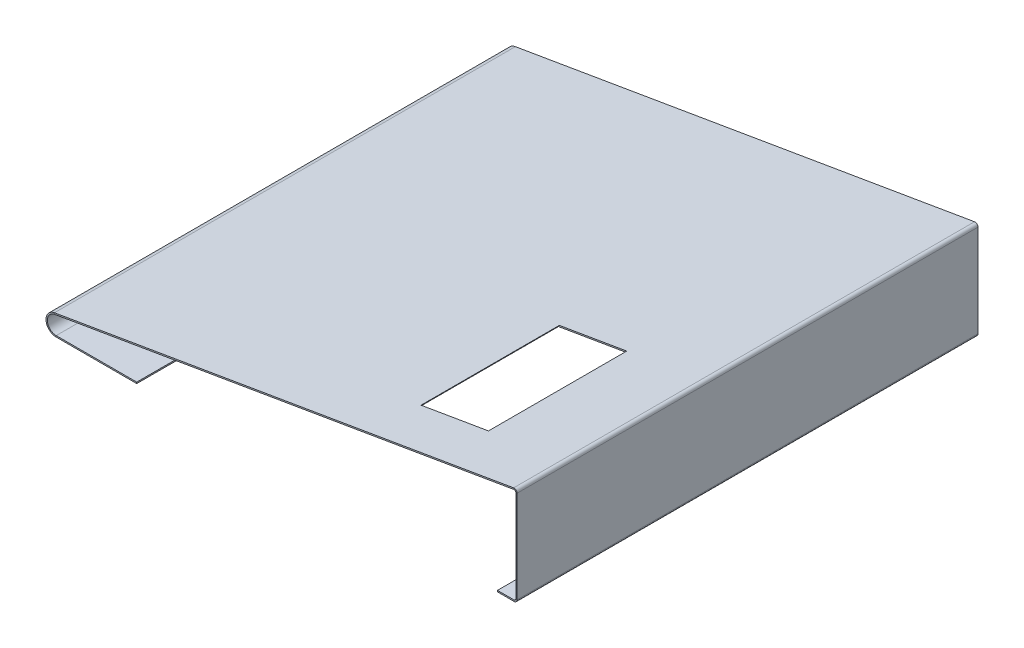
ISO-10303-21;
HEADER;
FILE_DESCRIPTION(('STEP AP214'),'2;1');
FILE_NAME('part.step','',(''),(''),'','','');
FILE_SCHEMA(('AUTOMOTIVE_DESIGN { 1 0 10303 214 1 1 1 1 }'));
ENDSEC;
DATA;
#1=APPLICATION_CONTEXT('core data for automotive mechanical design processes');
#2=APPLICATION_PROTOCOL_DEFINITION('international standard','automotive_design',2000,#1);
#3=PRODUCT_CONTEXT('',#1,'mechanical');
#4=PRODUCT('Part','Part','',(#3));
#5=PRODUCT_RELATED_PRODUCT_CATEGORY('part','',(#4));
#6=PRODUCT_DEFINITION_FORMATION('','',#4);
#7=PRODUCT_DEFINITION_CONTEXT('part definition',#1,'design');
#8=PRODUCT_DEFINITION('design','',#6,#7);
#9=PRODUCT_DEFINITION_SHAPE('','',#8);
#10=(LENGTH_UNIT() NAMED_UNIT(*) SI_UNIT(.MILLI.,.METRE.));
#11=(NAMED_UNIT(*) PLANE_ANGLE_UNIT() SI_UNIT($,.RADIAN.));
#12=(NAMED_UNIT(*) SI_UNIT($,.STERADIAN.) SOLID_ANGLE_UNIT());
#13=UNCERTAINTY_MEASURE_WITH_UNIT(LENGTH_MEASURE(1.E-05),#10,'distance_accuracy_value','');
#14=(GEOMETRIC_REPRESENTATION_CONTEXT(3) GLOBAL_UNCERTAINTY_ASSIGNED_CONTEXT((#13)) GLOBAL_UNIT_ASSIGNED_CONTEXT((#10,
#11,#12)) REPRESENTATION_CONTEXT('',''));
#15=CARTESIAN_POINT('',(0.,0.,0.));
#16=DIRECTION('',(0.,0.,1.));
#17=DIRECTION('',(1.,0.,0.));
#18=AXIS2_PLACEMENT_3D('',#15,#16,#17);
#19=CARTESIAN_POINT('',(-293.447847202276,721.981301966725,177.8));
#20=DIRECTION('',(-1.,0.,0.));
#21=DIRECTION('',(0.,-1.,0.));
#22=AXIS2_PLACEMENT_3D('',#19,#20,#21);
#23=PLANE('',#22);
#24=DIRECTION('',(0.,-1.,0.));
#25=VECTOR('',#24,1.);
#26=CARTESIAN_POINT('',(-293.447847202276,721.981301966725,177.8));
#27=LINE('',#26,#25);
#28=CARTESIAN_POINT('',(-293.447847202275,1.01599999999998,177.8));
#29=VERTEX_POINT('',#28);
#30=CARTESIAN_POINT('',(-293.447847202275,-1.11022302462516E-13,177.8));
#31=VERTEX_POINT('',#30);
#32=EDGE_CURVE('E75',#29,#31,#27,.T.);
#33=ORIENTED_EDGE('',*,*,#32,.T.);
#34=DIRECTION('',(0.,0.,-1.));
#35=VECTOR('',#34,1.);
#36=CARTESIAN_POINT('',(-293.447847202275,0.,177.8));
#37=LINE('',#36,#35);
#38=CARTESIAN_POINT('',(-293.447847202275,0.,-177.8));
#39=VERTEX_POINT('',#38);
#40=EDGE_CURVE('E68',#31,#39,#37,.T.);
#41=ORIENTED_EDGE('',*,*,#40,.T.);
#42=DIRECTION('',(0.,-1.,0.));
#43=VECTOR('',#42,1.);
#44=CARTESIAN_POINT('',(-293.447847202276,721.981301966725,-177.8));
#45=LINE('',#44,#43);
#46=CARTESIAN_POINT('',(-293.447847202276,1.01600000000009,-177.8));
#47=VERTEX_POINT('',#46);
#48=EDGE_CURVE('E325',#47,#39,#45,.T.);
#49=ORIENTED_EDGE('',*,*,#48,.F.);
#50=DIRECTION('',(0.,0.,1.));
#51=VECTOR('',#50,1.);
#52=CARTESIAN_POINT('',(-293.447847202275,1.01599999999998,177.8));
#53=LINE('',#52,#51);
#54=EDGE_CURVE('E44',#29,#47,#53,.F.);
#55=ORIENTED_EDGE('',*,*,#54,.F.);
#56=EDGE_LOOP('',(#33,#41,#49,#55));
#57=FACE_BOUND('',#56,.T.);
#58=ADVANCED_FACE('F34',(#57),#23,.F.);
#59=CARTESIAN_POINT('',(-355.6,721.981301966725,177.8));
#60=DIRECTION('',(0.,0.,-1.));
#61=DIRECTION('',(0.985896256736996,-0.167357613964763,0.));
#62=AXIS2_PLACEMENT_3D('',#59,#60,#61);
#63=PLANE('',#62);
#64=DIRECTION('',(0.,-1.,0.));
#65=VECTOR('',#64,1.);
#66=CARTESIAN_POINT('',(-355.6,721.981301966725,177.8));
#67=LINE('',#66,#65);
#68=CARTESIAN_POINT('',(-355.6,1.01599999999994,177.8));
#69=VERTEX_POINT('',#68);
#70=CARTESIAN_POINT('',(-355.6,0.,177.8));
#71=VERTEX_POINT('',#70);
#72=EDGE_CURVE('E221',#69,#71,#67,.T.);
#73=ORIENTED_EDGE('',*,*,#72,.T.);
#74=DIRECTION('',(1.,0.,0.));
#75=VECTOR('',#74,1.);
#76=CARTESIAN_POINT('',(0.,0.,177.8));
#77=LINE('',#76,#75);
#78=EDGE_CURVE('E216',#71,#31,#77,.T.);
#79=ORIENTED_EDGE('',*,*,#78,.T.);
#80=ORIENTED_EDGE('',*,*,#32,.F.);
#81=DIRECTION('',(1.,0.,0.));
#82=VECTOR('',#81,1.);
#83=CARTESIAN_POINT('',(-355.6,1.01599999999998,177.8));
#84=LINE('',#83,#82);
#85=EDGE_CURVE('E11',#69,#29,#84,.T.);
#86=ORIENTED_EDGE('',*,*,#85,.F.);
#87=EDGE_LOOP('',(#73,#79,#80,#86));
#88=FACE_BOUND('',#87,.T.);
#89=ADVANCED_FACE('F229',(#88),#63,.F.);
#90=CARTESIAN_POINT('',(0.,0.,177.8));
#91=DIRECTION('',(0.,1.,0.));
#92=DIRECTION('',(-1.,0.,0.));
#93=AXIS2_PLACEMENT_3D('',#90,#91,#92);
#94=PLANE('',#93);
#95=ORIENTED_EDGE('',*,*,#40,.F.);
#96=ORIENTED_EDGE('',*,*,#78,.F.);
#97=DIRECTION('',(0.,0.,-1.));
#98=VECTOR('',#97,1.);
#99=CARTESIAN_POINT('',(-355.6,0.,177.8));
#100=LINE('',#99,#98);
#101=CARTESIAN_POINT('',(-355.6,0.,-177.8));
#102=VERTEX_POINT('',#101);
#103=EDGE_CURVE('E207',#71,#102,#100,.T.);
#104=ORIENTED_EDGE('',*,*,#103,.T.);
#105=DIRECTION('',(1.,0.,0.));
#106=VECTOR('',#105,1.);
#107=CARTESIAN_POINT('',(0.,0.,-177.8));
#108=LINE('',#107,#106);
#109=EDGE_CURVE('E215',#102,#39,#108,.T.);
#110=ORIENTED_EDGE('',*,*,#109,.T.);
#111=EDGE_LOOP('',(#95,#96,#104,#110));
#112=FACE_BOUND('',#111,.T.);
#113=ADVANCED_FACE('F227',(#112),#94,.F.);
#114=CARTESIAN_POINT('',(-355.6,721.981301966725,-177.8));
#115=DIRECTION('',(0.,0.,-1.));
#116=DIRECTION('',(0.985896256736996,-0.167357613964763,0.));
#117=AXIS2_PLACEMENT_3D('',#114,#115,#116);
#118=PLANE('',#117);
#119=ORIENTED_EDGE('',*,*,#109,.F.);
#120=DIRECTION('',(0.,-1.,0.));
#121=VECTOR('',#120,1.);
#122=CARTESIAN_POINT('',(-355.6,721.981301966725,-177.8));
#123=LINE('',#122,#121);
#124=CARTESIAN_POINT('',(-355.6,1.01599999999994,-177.8));
#125=VERTEX_POINT('',#124);
#126=EDGE_CURVE('E235',#125,#102,#123,.T.);
#127=ORIENTED_EDGE('',*,*,#126,.F.);
#128=DIRECTION('',(1.,0.,0.));
#129=VECTOR('',#128,1.);
#130=CARTESIAN_POINT('',(-355.6,1.01599999999998,-177.8));
#131=LINE('',#130,#129);
#132=EDGE_CURVE('E53',#125,#47,#131,.T.);
#133=ORIENTED_EDGE('',*,*,#132,.T.);
#134=ORIENTED_EDGE('',*,*,#48,.T.);
#135=EDGE_LOOP('',(#119,#127,#133,#134));
#136=FACE_BOUND('',#135,.T.);
#137=ADVANCED_FACE('F329',(#136),#118,.T.);
#138=CARTESIAN_POINT('',(0.,1.01600000000002,177.8));
#139=DIRECTION('',(0.,1.,0.));
#140=DIRECTION('',(-1.,0.,0.));
#141=AXIS2_PLACEMENT_3D('',#138,#139,#140);
#142=PLANE('',#141);
#143=ORIENTED_EDGE('',*,*,#54,.T.);
#144=ORIENTED_EDGE('',*,*,#132,.F.);
#145=DIRECTION('',(0.,0.,1.));
#146=VECTOR('',#145,1.);
#147=CARTESIAN_POINT('',(-355.6,1.01599999999998,177.8));
#148=LINE('',#147,#146);
#149=EDGE_CURVE('E38',#69,#125,#148,.F.);
#150=ORIENTED_EDGE('',*,*,#149,.F.);
#151=ORIENTED_EDGE('',*,*,#85,.T.);
#152=EDGE_LOOP('',(#143,#144,#150,#151));
#153=FACE_BOUND('',#152,.T.);
#154=ADVANCED_FACE('F36',(#153),#142,.T.);
#155=CARTESIAN_POINT('',(-15.1470310183191,711.664994555315,177.8));
#156=DIRECTION('',(1.,0.,0.));
#157=DIRECTION('',(0.,1.,0.));
#158=AXIS2_PLACEMENT_3D('',#155,#156,#157);
#159=PLANE('',#158);
#160=DIRECTION('',(0.,-1.,0.));
#161=VECTOR('',#160,1.);
#162=CARTESIAN_POINT('',(-15.147031018319,711.664994555315,-177.8));
#163=LINE('',#162,#161);
#164=CARTESIAN_POINT('',(-15.1470310183189,1.01600000000009,-177.8));
#165=VERTEX_POINT('',#164);
#166=CARTESIAN_POINT('',(-15.147031018319,0.,-177.8));
#167=VERTEX_POINT('',#166);
#168=EDGE_CURVE('E316',#165,#167,#163,.T.);
#169=ORIENTED_EDGE('',*,*,#168,.T.);
#170=DIRECTION('',(0.,0.,1.));
#171=VECTOR('',#170,1.);
#172=CARTESIAN_POINT('',(-15.147031018319,0.,177.8));
#173=LINE('',#172,#171);
#174=CARTESIAN_POINT('',(-15.147031018319,0.,177.8));
#175=VERTEX_POINT('',#174);
#176=EDGE_CURVE('E312',#167,#175,#173,.T.);
#177=ORIENTED_EDGE('',*,*,#176,.T.);
#178=DIRECTION('',(0.,-1.,0.));
#179=VECTOR('',#178,1.);
#180=CARTESIAN_POINT('',(-15.1470310183191,711.664994555315,177.8));
#181=LINE('',#180,#179);
#182=CARTESIAN_POINT('',(-15.147031018319,1.01599999999999,177.8));
#183=VERTEX_POINT('',#182);
#184=EDGE_CURVE('E307',#183,#175,#181,.T.);
#185=ORIENTED_EDGE('',*,*,#184,.F.);
#186=DIRECTION('',(0.,0.,-1.));
#187=VECTOR('',#186,1.);
#188=CARTESIAN_POINT('',(-15.147031018319,1.016,177.8));
#189=LINE('',#188,#187);
#190=EDGE_CURVE('E130',#165,#183,#189,.F.);
#191=ORIENTED_EDGE('',*,*,#190,.F.);
#192=EDGE_LOOP('',(#169,#177,#185,#191));
#193=FACE_BOUND('',#192,.T.);
#194=ADVANCED_FACE('F335',(#193),#159,.F.);
#195=CARTESIAN_POINT('',(0.,1.01600000000002,177.8));
#196=DIRECTION('',(0.,1.,0.));
#197=DIRECTION('',(-1.,0.,0.));
#198=AXIS2_PLACEMENT_3D('',#195,#196,#197);
#199=PLANE('',#198);
#200=DIRECTION('',(0.,0.,1.));
#201=VECTOR('',#200,1.);
#202=CARTESIAN_POINT('',(-2.28599999999998,1.01600000000009,-177.8));
#203=LINE('',#202,#201);
#204=CARTESIAN_POINT('',(-2.28599999999995,1.01600000000002,-177.8));
#205=VERTEX_POINT('',#204);
#206=CARTESIAN_POINT('',(-2.28599999999995,1.01600000000002,177.8));
#207=VERTEX_POINT('',#206);
#208=EDGE_CURVE('E290',#205,#207,#203,.T.);
#209=ORIENTED_EDGE('',*,*,#208,.F.);
#210=DIRECTION('',(1.,0.,0.));
#211=VECTOR('',#210,1.);
#212=CARTESIAN_POINT('',(-355.6,1.01599999999996,-177.8));
#213=LINE('',#212,#211);
#214=EDGE_CURVE('E295',#165,#205,#213,.T.);
#215=ORIENTED_EDGE('',*,*,#214,.F.);
#216=ORIENTED_EDGE('',*,*,#190,.T.);
#217=DIRECTION('',(1.,0.,0.));
#218=VECTOR('',#217,1.);
#219=CARTESIAN_POINT('',(-355.6,1.01599999999996,177.8));
#220=LINE('',#219,#218);
#221=EDGE_CURVE('E124',#183,#207,#220,.T.);
#222=ORIENTED_EDGE('',*,*,#221,.T.);
#223=EDGE_LOOP('',(#209,#215,#216,#222));
#224=FACE_BOUND('',#223,.T.);
#225=ADVANCED_FACE('F388',(#224),#199,.T.);
#226=CARTESIAN_POINT('',(-355.6,711.664994555315,177.8));
#227=DIRECTION('',(0.,0.,-1.));
#228=DIRECTION('',(0.985896256736996,-0.167357613964763,0.));
#229=AXIS2_PLACEMENT_3D('',#226,#227,#228);
#230=PLANE('',#229);
#231=ORIENTED_EDGE('',*,*,#184,.T.);
#232=DIRECTION('',(1.,0.,0.));
#233=VECTOR('',#232,1.);
#234=CARTESIAN_POINT('',(0.,0.,177.8));
#235=LINE('',#234,#233);
#236=CARTESIAN_POINT('',(-2.28599999999997,0.,177.8));
#237=VERTEX_POINT('',#236);
#238=EDGE_CURVE('E304',#175,#237,#235,.T.);
#239=ORIENTED_EDGE('',*,*,#238,.T.);
#240=DIRECTION('',(0.,-1.,0.));
#241=VECTOR('',#240,1.);
#242=CARTESIAN_POINT('',(-2.28600000000004,711.664994555315,177.8));
#243=LINE('',#242,#241);
#244=EDGE_CURVE('E284',#207,#237,#243,.T.);
#245=ORIENTED_EDGE('',*,*,#244,.F.);
#246=ORIENTED_EDGE('',*,*,#221,.F.);
#247=EDGE_LOOP('',(#231,#239,#245,#246));
#248=FACE_BOUND('',#247,.T.);
#249=ADVANCED_FACE('F384',(#248),#230,.F.);
#250=CARTESIAN_POINT('',(0.,0.,177.8));
#251=DIRECTION('',(0.,1.,0.));
#252=DIRECTION('',(-1.,0.,0.));
#253=AXIS2_PLACEMENT_3D('',#250,#251,#252);
#254=PLANE('',#253);
#255=DIRECTION('',(1.,0.,0.));
#256=VECTOR('',#255,1.);
#257=CARTESIAN_POINT('',(0.,0.,-177.8));
#258=LINE('',#257,#256);
#259=CARTESIAN_POINT('',(-2.28599999999994,0.,-177.8));
#260=VERTEX_POINT('',#259);
#261=EDGE_CURVE('E301',#167,#260,#258,.T.);
#262=ORIENTED_EDGE('',*,*,#261,.T.);
#263=DIRECTION('',(0.,0.,1.));
#264=VECTOR('',#263,1.);
#265=CARTESIAN_POINT('',(-2.286,0.,-177.8));
#266=LINE('',#265,#264);
#267=EDGE_CURVE('E298',#260,#237,#266,.T.);
#268=ORIENTED_EDGE('',*,*,#267,.T.);
#269=ORIENTED_EDGE('',*,*,#238,.F.);
#270=ORIENTED_EDGE('',*,*,#176,.F.);
#271=EDGE_LOOP('',(#262,#268,#269,#270));
#272=FACE_BOUND('',#271,.T.);
#273=ADVANCED_FACE('F380',(#272),#254,.F.);
#274=CARTESIAN_POINT('',(-355.6,711.664994555315,-177.8));
#275=DIRECTION('',(0.,0.,-1.));
#276=DIRECTION('',(0.985896256736996,-0.167357613964763,0.));
#277=AXIS2_PLACEMENT_3D('',#274,#275,#276);
#278=PLANE('',#277);
#279=ORIENTED_EDGE('',*,*,#261,.F.);
#280=ORIENTED_EDGE('',*,*,#168,.F.);
#281=ORIENTED_EDGE('',*,*,#214,.T.);
#282=DIRECTION('',(0.,-1.,0.));
#283=VECTOR('',#282,1.);
#284=CARTESIAN_POINT('',(-2.28600000000004,711.664994555315,-177.8));
#285=LINE('',#284,#283);
#286=EDGE_CURVE('E292',#205,#260,#285,.T.);
#287=ORIENTED_EDGE('',*,*,#286,.T.);
#288=EDGE_LOOP('',(#279,#280,#281,#287));
#289=FACE_BOUND('',#288,.T.);
#290=ADVANCED_FACE('F376',(#289),#278,.T.);
#291=CARTESIAN_POINT('',(-2.286,2.28600000000001,-818.521085157231));
#292=DIRECTION('',(0.,0.,1.));
#293=DIRECTION('',(-0.167357613964763,-0.985896256736996,0.));
#294=AXIS2_PLACEMENT_3D('',#291,#292,#293);
#295=CYLINDRICAL_SURFACE('',#294,1.27);
#296=CARTESIAN_POINT('',(-2.286,2.28600000000001,-177.8));
#297=DIRECTION('',(0.,0.,1.));
#298=DIRECTION('',(-0.167357613964763,-0.985896256736996,0.));
#299=AXIS2_PLACEMENT_3D('',#296,#297,#298);
#300=CIRCLE('',#299,1.27);
#301=CARTESIAN_POINT('',(-1.01599999999999,2.28600000000002,-177.8));
#302=VERTEX_POINT('',#301);
#303=EDGE_CURVE('E274',#205,#302,#300,.T.);
#304=ORIENTED_EDGE('',*,*,#303,.F.);
#305=ORIENTED_EDGE('',*,*,#208,.T.);
#306=CARTESIAN_POINT('',(-2.286,2.28600000000001,177.8));
#307=DIRECTION('',(0.,0.,1.));
#308=DIRECTION('',(-0.167357613964763,-0.985896256736996,0.));
#309=AXIS2_PLACEMENT_3D('',#306,#307,#308);
#310=CIRCLE('',#309,1.27);
#311=CARTESIAN_POINT('',(-1.01600000000003,2.28600000000001,177.8));
#312=VERTEX_POINT('',#311);
#313=EDGE_CURVE('E287',#312,#207,#310,.F.);
#314=ORIENTED_EDGE('',*,*,#313,.F.);
#315=DIRECTION('',(0.,0.,1.));
#316=VECTOR('',#315,1.);
#317=CARTESIAN_POINT('',(-1.0160000000001,2.28600000000002,-177.8));
#318=LINE('',#317,#316);
#319=EDGE_CURVE('E242',#302,#312,#318,.T.);
#320=ORIENTED_EDGE('',*,*,#319,.F.);
#321=EDGE_LOOP('',(#304,#305,#314,#320));
#322=FACE_BOUND('',#321,.T.);
#323=ADVANCED_FACE('F372',(#322),#295,.F.);
#324=CARTESIAN_POINT('',(-2.286,2.28600000000001,177.8));
#325=DIRECTION('',(0.,0.,1.));
#326=DIRECTION('',(-0.167357613964763,-0.985896256736996,0.));
#327=AXIS2_PLACEMENT_3D('',#324,#325,#326);
#328=PLANE('',#327);
#329=DIRECTION('',(1.,0.,0.));
#330=VECTOR('',#329,1.);
#331=CARTESIAN_POINT('',(-725.318776145699,2.28600000000011,177.8));
#332=LINE('',#331,#330);
#333=CARTESIAN_POINT('',(0.,2.28600000000004,177.8));
#334=VERTEX_POINT('',#333);
#335=EDGE_CURVE('E257',#312,#334,#332,.T.);
#336=ORIENTED_EDGE('',*,*,#335,.F.);
#337=ORIENTED_EDGE('',*,*,#313,.T.);
#338=ORIENTED_EDGE('',*,*,#244,.T.);
#339=CARTESIAN_POINT('',(-2.286,2.28600000000001,177.8));
#340=DIRECTION('',(0.,0.,1.));
#341=DIRECTION('',(-0.167357613964763,-0.985896256736996,0.));
#342=AXIS2_PLACEMENT_3D('',#339,#340,#341);
#343=CIRCLE('',#342,2.286);
#344=EDGE_CURVE('E276',#334,#237,#343,.F.);
#345=ORIENTED_EDGE('',*,*,#344,.F.);
#346=EDGE_LOOP('',(#336,#337,#338,#345));
#347=FACE_BOUND('',#346,.T.);
#348=ADVANCED_FACE('F368',(#347),#328,.T.);
#349=CARTESIAN_POINT('',(-2.286,2.28600000000001,-818.521085157231));
#350=DIRECTION('',(0.,0.,1.));
#351=DIRECTION('',(-0.167357613964763,-0.985896256736996,0.));
#352=AXIS2_PLACEMENT_3D('',#349,#350,#351);
#353=CYLINDRICAL_SURFACE('',#352,2.286);
#354=CARTESIAN_POINT('',(-2.286,2.28600000000001,-177.8));
#355=DIRECTION('',(0.,0.,1.));
#356=DIRECTION('',(-0.167357613964763,-0.985896256736996,0.));
#357=AXIS2_PLACEMENT_3D('',#354,#355,#356);
#358=CIRCLE('',#357,2.286);
#359=CARTESIAN_POINT('',(0.,2.28600000000004,-177.8));
#360=VERTEX_POINT('',#359);
#361=EDGE_CURVE('E281',#260,#360,#358,.T.);
#362=ORIENTED_EDGE('',*,*,#361,.T.);
#363=DIRECTION('',(0.,0.,1.));
#364=VECTOR('',#363,1.);
#365=CARTESIAN_POINT('',(0.,2.28600000000001,-177.8));
#366=LINE('',#365,#364);
#367=EDGE_CURVE('E278',#360,#334,#366,.T.);
#368=ORIENTED_EDGE('',*,*,#367,.T.);
#369=ORIENTED_EDGE('',*,*,#344,.T.);
#370=ORIENTED_EDGE('',*,*,#267,.F.);
#371=EDGE_LOOP('',(#362,#368,#369,#370));
#372=FACE_BOUND('',#371,.T.);
#373=ADVANCED_FACE('F364',(#372),#353,.T.);
#374=CARTESIAN_POINT('',(-2.286,2.28600000000001,-177.8));
#375=DIRECTION('',(0.,0.,-1.));
#376=DIRECTION('',(0.167357613964763,0.985896256736996,0.));
#377=AXIS2_PLACEMENT_3D('',#374,#375,#376);
#378=PLANE('',#377);
#379=ORIENTED_EDGE('',*,*,#286,.F.);
#380=ORIENTED_EDGE('',*,*,#303,.T.);
#381=DIRECTION('',(1.,0.,0.));
#382=VECTOR('',#381,1.);
#383=CARTESIAN_POINT('',(-725.318776145699,2.28600000000011,-177.8));
#384=LINE('',#383,#382);
#385=EDGE_CURVE('E272',#302,#360,#384,.T.);
#386=ORIENTED_EDGE('',*,*,#385,.T.);
#387=ORIENTED_EDGE('',*,*,#361,.F.);
#388=EDGE_LOOP('',(#379,#380,#386,#387));
#389=FACE_BOUND('',#388,.T.);
#390=ADVANCED_FACE('F360',(#389),#378,.T.);
#391=CARTESIAN_POINT('',(-725.318776145699,7.86190476190478,-177.8));
#392=DIRECTION('',(0.,0.,-1.));
#393=DIRECTION('',(0.167357613964763,0.985896256736996,0.));
#394=AXIS2_PLACEMENT_3D('',#391,#392,#393);
#395=PLANE('',#394);
#396=DIRECTION('',(0.,1.,0.));
#397=VECTOR('',#396,1.);
#398=CARTESIAN_POINT('',(0.,76.2,-177.8));
#399=LINE('',#398,#397);
#400=CARTESIAN_POINT('',(0.,73.4932451185527,-177.8));
#401=VERTEX_POINT('',#400);
#402=EDGE_CURVE('E263',#360,#401,#399,.T.);
#403=ORIENTED_EDGE('',*,*,#402,.F.);
#404=ORIENTED_EDGE('',*,*,#385,.F.);
#405=DIRECTION('',(0.,1.,0.));
#406=VECTOR('',#405,1.);
#407=CARTESIAN_POINT('',(-1.01600000000002,7.86190476190472,-177.8));
#408=LINE('',#407,#406);
#409=CARTESIAN_POINT('',(-1.01599999999999,73.4932451185527,-177.8));
#410=VERTEX_POINT('',#409);
#411=EDGE_CURVE('E269',#302,#410,#408,.T.);
#412=ORIENTED_EDGE('',*,*,#411,.T.);
#413=DIRECTION('',(1.,0.,0.));
#414=VECTOR('',#413,1.);
#415=CARTESIAN_POINT('',(-725.318776145699,73.4932451185528,-177.8));
#416=LINE('',#415,#414);
#417=EDGE_CURVE('E266',#410,#401,#416,.T.);
#418=ORIENTED_EDGE('',*,*,#417,.T.);
#419=EDGE_LOOP('',(#403,#404,#412,#418));
#420=FACE_BOUND('',#419,.T.);
#421=ADVANCED_FACE('F356',(#420),#395,.T.);
#422=CARTESIAN_POINT('',(0.,76.2,177.8));
#423=DIRECTION('',(-1.,0.,0.));
#424=DIRECTION('',(0.,-1.,0.));
#425=AXIS2_PLACEMENT_3D('',#422,#423,#424);
#426=PLANE('',#425);
#427=ORIENTED_EDGE('',*,*,#367,.F.);
#428=ORIENTED_EDGE('',*,*,#402,.T.);
#429=DIRECTION('',(0.,0.,1.));
#430=VECTOR('',#429,1.);
#431=CARTESIAN_POINT('',(0.,73.4932451185527,-177.8));
#432=LINE('',#431,#430);
#433=CARTESIAN_POINT('',(0.,73.4932451185527,177.8));
#434=VERTEX_POINT('',#433);
#435=EDGE_CURVE('E260',#401,#434,#432,.T.);
#436=ORIENTED_EDGE('',*,*,#435,.T.);
#437=DIRECTION('',(0.,1.,0.));
#438=VECTOR('',#437,1.);
#439=CARTESIAN_POINT('',(0.,76.2,177.8));
#440=LINE('',#439,#438);
#441=EDGE_CURVE('E249',#334,#434,#440,.T.);
#442=ORIENTED_EDGE('',*,*,#441,.F.);
#443=EDGE_LOOP('',(#427,#428,#436,#442));
#444=FACE_BOUND('',#443,.T.);
#445=ADVANCED_FACE('F352',(#444),#426,.F.);
#446=CARTESIAN_POINT('',(-725.318776145699,7.86190476190478,177.8));
#447=DIRECTION('',(0.,0.,-1.));
#448=DIRECTION('',(0.167357613964763,0.985896256736996,0.));
#449=AXIS2_PLACEMENT_3D('',#446,#447,#448);
#450=PLANE('',#449);
#451=ORIENTED_EDGE('',*,*,#335,.T.);
#452=ORIENTED_EDGE('',*,*,#441,.T.);
#453=DIRECTION('',(1.,0.,0.));
#454=VECTOR('',#453,1.);
#455=CARTESIAN_POINT('',(-725.318776145699,73.4932451185528,177.8));
#456=LINE('',#455,#454);
#457=CARTESIAN_POINT('',(-1.01599999999999,73.4932451185527,177.8));
#458=VERTEX_POINT('',#457);
#459=EDGE_CURVE('E318',#458,#434,#456,.T.);
#460=ORIENTED_EDGE('',*,*,#459,.F.);
#461=DIRECTION('',(0.,1.,0.));
#462=VECTOR('',#461,1.);
#463=CARTESIAN_POINT('',(-1.01600000000002,7.86190476190472,177.8));
#464=LINE('',#463,#462);
#465=EDGE_CURVE('E239',#312,#458,#464,.T.);
#466=ORIENTED_EDGE('',*,*,#465,.F.);
#467=EDGE_LOOP('',(#451,#452,#460,#466));
#468=FACE_BOUND('',#467,.T.);
#469=ADVANCED_FACE('F349',(#468),#450,.F.);
#470=CARTESIAN_POINT('',(-1.01599999999999,76.2,177.8));
#471=DIRECTION('',(-1.,0.,0.));
#472=DIRECTION('',(0.,-1.,0.));
#473=AXIS2_PLACEMENT_3D('',#470,#471,#472);
#474=PLANE('',#473);
#475=ORIENTED_EDGE('',*,*,#411,.F.);
#476=ORIENTED_EDGE('',*,*,#319,.T.);
#477=ORIENTED_EDGE('',*,*,#465,.T.);
#478=DIRECTION('',(0.,0.,1.));
#479=VECTOR('',#478,1.);
#480=CARTESIAN_POINT('',(-1.01600000000009,73.4932451185527,-177.8));
#481=LINE('',#480,#479);
#482=EDGE_CURVE('E320',#410,#458,#481,.T.);
#483=ORIENTED_EDGE('',*,*,#482,.F.);
#484=EDGE_LOOP('',(#475,#476,#477,#483));
#485=FACE_BOUND('',#484,.T.);
#486=ADVANCED_FACE('F345',(#485),#474,.T.);
#487=CARTESIAN_POINT('',(-356.915749622171,15.6129272374894,177.8));
#488=DIRECTION('',(0.167357613964763,-0.985896256736996,0.));
#489=DIRECTION('',(0.985896256736996,0.167357613964763,0.));
#490=AXIS2_PLACEMENT_3D('',#487,#488,#489);
#491=PLANE('',#490);
#492=DIRECTION('',(0.985896256736996,0.167357613964763,0.));
#493=VECTOR('',#492,1.);
#494=CARTESIAN_POINT('',(-356.915749622171,15.6129272374894,33.02));
#495=LINE('',#494,#493);
#496=CARTESIAN_POINT('',(-112.204290820482,57.1531253821023,33.02));
#497=VERTEX_POINT('',#496);
#498=CARTESIAN_POINT('',(-60.178400158324,65.9846113179832,33.02));
#499=VERTEX_POINT('',#498);
#500=EDGE_CURVE('E688',#497,#499,#495,.T.);
#501=ORIENTED_EDGE('',*,*,#500,.T.);
#502=DIRECTION('',(0.,0.,1.));
#503=VECTOR('',#502,1.);
#504=CARTESIAN_POINT('',(-60.178400158324,65.9846113179832,177.8));
#505=LINE('',#504,#503);
#506=CARTESIAN_POINT('',(-60.178400158324,65.9846113179832,139.7));
#507=VERTEX_POINT('',#506);
#508=EDGE_CURVE('E683',#499,#507,#505,.T.);
#509=ORIENTED_EDGE('',*,*,#508,.T.);
#510=DIRECTION('',(-0.985896256736996,-0.167357613964763,0.));
#511=VECTOR('',#510,1.);
#512=CARTESIAN_POINT('',(-356.915749622171,15.6129272374894,139.7));
#513=LINE('',#512,#511);
#514=CARTESIAN_POINT('',(-112.204290820482,57.1531253821022,139.7));
#515=VERTEX_POINT('',#514);
#516=EDGE_CURVE('E695',#507,#515,#513,.T.);
#517=ORIENTED_EDGE('',*,*,#516,.T.);
#518=DIRECTION('',(0.,0.,-1.));
#519=VECTOR('',#518,1.);
#520=CARTESIAN_POINT('',(-112.204290820482,57.1531253821023,177.8));
#521=LINE('',#520,#519);
#522=EDGE_CURVE('E692',#515,#497,#521,.T.);
#523=ORIENTED_EDGE('',*,*,#522,.T.);
#524=EDGE_LOOP('',(#501,#509,#517,#523));
#525=FACE_BOUND('',#524,.T.);
#526=DIRECTION('',(0.,0.,1.));
#527=VECTOR('',#526,1.);
#528=CARTESIAN_POINT('',(-2.66857950552346,75.7470039614535,-177.8));
#529=LINE('',#528,#527);
#530=CARTESIAN_POINT('',(-2.66857950552332,75.7470039614535,-177.8));
#531=VERTEX_POINT('',#530);
#532=CARTESIAN_POINT('',(-2.66857950552328,75.7470039614535,177.8));
#533=VERTEX_POINT('',#532);
#534=EDGE_CURVE('E709',#531,#533,#529,.T.);
#535=ORIENTED_EDGE('',*,*,#534,.F.);
#536=DIRECTION('',(-0.985896256736996,-0.167357613964763,0.));
#537=VECTOR('',#536,1.);
#538=CARTESIAN_POINT('',(-356.915749622171,15.6129272374894,-177.8));
#539=LINE('',#538,#537);
#540=CARTESIAN_POINT('',(-356.915749622171,15.6129272374894,-177.8));
#541=VERTEX_POINT('',#540);
#542=EDGE_CURVE('E698',#531,#541,#539,.T.);
#543=ORIENTED_EDGE('',*,*,#542,.T.);
#544=DIRECTION('',(0.,0.,-1.));
#545=VECTOR('',#544,1.);
#546=CARTESIAN_POINT('',(-356.915749622171,15.6129272374894,177.8));
#547=LINE('',#546,#545);
#548=CARTESIAN_POINT('',(-356.915749622171,15.6129272374894,177.8));
#549=VERTEX_POINT('',#548);
#550=EDGE_CURVE('E701',#549,#541,#547,.T.);
#551=ORIENTED_EDGE('',*,*,#550,.F.);
#552=DIRECTION('',(-0.985896256736996,-0.167357613964763,0.));
#553=VECTOR('',#552,1.);
#554=CARTESIAN_POINT('',(-356.915749622171,15.6129272374894,177.8));
#555=LINE('',#554,#553);
#556=EDGE_CURVE('E703',#533,#549,#555,.T.);
#557=ORIENTED_EDGE('',*,*,#556,.F.);
#558=EDGE_LOOP('',(#535,#543,#551,#557));
#559=FACE_BOUND('',#558,.T.);
#560=ADVANCED_FACE('F348',(#525,#559),#491,.F.);
#561=CARTESIAN_POINT('',(-356.745714286382,14.6112566406446,177.8));
#562=DIRECTION('',(0.167357613964763,-0.985896256736996,0.));
#563=DIRECTION('',(0.985896256736996,0.167357613964763,0.));
#564=AXIS2_PLACEMENT_3D('',#561,#562,#563);
#565=PLANE('',#564);
#566=DIRECTION('',(0.,0.,1.));
#567=VECTOR('',#566,1.);
#568=CARTESIAN_POINT('',(-60.8380269992144,64.8421041155251,177.8));
#569=LINE('',#568,#567);
#570=CARTESIAN_POINT('',(-60.8380269992143,64.8421041155251,33.02));
#571=VERTEX_POINT('',#570);
#572=CARTESIAN_POINT('',(-60.8380269992143,64.8421041155251,139.7));
#573=VERTEX_POINT('',#572);
#574=EDGE_CURVE('E659',#571,#573,#569,.T.);
#575=ORIENTED_EDGE('',*,*,#574,.F.);
#576=DIRECTION('',(0.985896256736996,0.167357613964763,0.));
#577=VECTOR('',#576,1.);
#578=CARTESIAN_POINT('',(-356.745714286382,14.6112566406446,33.02));
#579=LINE('',#578,#577);
#580=CARTESIAN_POINT('',(-112.863917661373,56.0106181796442,33.02));
#581=VERTEX_POINT('',#580);
#582=EDGE_CURVE('E664',#581,#571,#579,.T.);
#583=ORIENTED_EDGE('',*,*,#582,.F.);
#584=DIRECTION('',(0.,0.,-1.));
#585=VECTOR('',#584,1.);
#586=CARTESIAN_POINT('',(-112.863917661373,56.0106181796442,177.8));
#587=LINE('',#586,#585);
#588=CARTESIAN_POINT('',(-112.863917661373,56.0106181796441,139.7));
#589=VERTEX_POINT('',#588);
#590=EDGE_CURVE('E667',#589,#581,#587,.T.);
#591=ORIENTED_EDGE('',*,*,#590,.F.);
#592=DIRECTION('',(-0.985896256736996,-0.167357613964763,0.));
#593=VECTOR('',#592,1.);
#594=CARTESIAN_POINT('',(-356.745714286382,14.6112566406446,139.7));
#595=LINE('',#594,#593);
#596=EDGE_CURVE('E670',#573,#589,#595,.T.);
#597=ORIENTED_EDGE('',*,*,#596,.F.);
#598=EDGE_LOOP('',(#575,#583,#591,#597));
#599=FACE_BOUND('',#598,.T.);
#600=DIRECTION('',(-0.985896256736996,-0.167357613964763,0.));
#601=VECTOR('',#600,1.);
#602=CARTESIAN_POINT('',(-356.745714286382,14.6112566406446,-177.8));
#603=LINE('',#602,#601);
#604=CARTESIAN_POINT('',(-2.49854416973518,74.7453333646088,-177.8));
#605=VERTEX_POINT('',#604);
#606=CARTESIAN_POINT('',(-356.745714286382,14.6112566406446,-177.8));
#607=VERTEX_POINT('',#606);
#608=EDGE_CURVE('E672',#605,#607,#603,.T.);
#609=ORIENTED_EDGE('',*,*,#608,.F.);
#610=DIRECTION('',(0.,0.,1.));
#611=VECTOR('',#610,1.);
#612=CARTESIAN_POINT('',(-2.49854416973527,74.7453333646088,-177.8));
#613=LINE('',#612,#611);
#614=CARTESIAN_POINT('',(-2.49854416973512,74.7453333646087,177.8));
#615=VERTEX_POINT('',#614);
#616=EDGE_CURVE('E706',#605,#615,#613,.T.);
#617=ORIENTED_EDGE('',*,*,#616,.T.);
#618=DIRECTION('',(-0.985896256736996,-0.167357613964763,0.));
#619=VECTOR('',#618,1.);
#620=CARTESIAN_POINT('',(-356.745714286382,14.6112566406446,177.8));
#621=LINE('',#620,#619);
#622=CARTESIAN_POINT('',(-356.745714286382,14.6112566406446,177.8));
#623=VERTEX_POINT('',#622);
#624=EDGE_CURVE('E675',#615,#623,#621,.T.);
#625=ORIENTED_EDGE('',*,*,#624,.T.);
#626=DIRECTION('',(0.,0.,-1.));
#627=VECTOR('',#626,1.);
#628=CARTESIAN_POINT('',(-356.745714286382,14.6112566406446,177.8));
#629=LINE('',#628,#627);
#630=EDGE_CURVE('E650',#623,#607,#629,.T.);
#631=ORIENTED_EDGE('',*,*,#630,.T.);
#632=EDGE_LOOP('',(#609,#617,#625,#631));
#633=FACE_BOUND('',#632,.T.);
#634=ADVANCED_FACE('F406',(#599,#633),#565,.T.);
#635=CARTESIAN_POINT('',(-199.766723549127,-94.5094569382422,139.7));
#636=DIRECTION('',(0.,0.,1.));
#637=DIRECTION('',(0.,-1.,0.));
#638=AXIS2_PLACEMENT_3D('',#635,#636,#637);
#639=PLANE('',#638);
#640=DIRECTION('',(0.500000000000002,0.866025403784438,0.));
#641=VECTOR('',#640,1.);
#642=CARTESIAN_POINT('',(-164.571451139328,-114.829456938242,139.7));
#643=LINE('',#642,#641);
#644=EDGE_CURVE('E681',#573,#507,#643,.T.);
#645=ORIENTED_EDGE('',*,*,#644,.F.);
#646=ORIENTED_EDGE('',*,*,#596,.T.);
#647=DIRECTION('',(0.500000000000002,0.866025403784438,0.));
#648=VECTOR('',#647,1.);
#649=CARTESIAN_POINT('',(-199.766723549127,-94.5094569382422,139.7));
#650=LINE('',#649,#648);
#651=EDGE_CURVE('E146',#589,#515,#650,.T.);
#652=ORIENTED_EDGE('',*,*,#651,.T.);
#653=ORIENTED_EDGE('',*,*,#516,.F.);
#654=EDGE_LOOP('',(#645,#646,#652,#653));
#655=FACE_BOUND('',#654,.T.);
#656=ADVANCED_FACE('F408',(#655),#639,.F.);
#657=CARTESIAN_POINT('',(-199.766723549127,-94.5094569382421,33.02));
#658=DIRECTION('',(-0.866025403784438,0.500000000000002,0.));
#659=DIRECTION('',(-0.500000000000002,-0.866025403784438,0.));
#660=AXIS2_PLACEMENT_3D('',#657,#658,#659);
#661=PLANE('',#660);
#662=ORIENTED_EDGE('',*,*,#651,.F.);
#663=ORIENTED_EDGE('',*,*,#590,.T.);
#664=DIRECTION('',(0.500000000000002,0.866025403784438,0.));
#665=VECTOR('',#664,1.);
#666=CARTESIAN_POINT('',(-199.766723549127,-94.5094569382421,33.02));
#667=LINE('',#666,#665);
#668=EDGE_CURVE('E686',#581,#497,#667,.T.);
#669=ORIENTED_EDGE('',*,*,#668,.T.);
#670=ORIENTED_EDGE('',*,*,#522,.F.);
#671=EDGE_LOOP('',(#662,#663,#669,#670));
#672=FACE_BOUND('',#671,.T.);
#673=ADVANCED_FACE('F411',(#672),#661,.F.);
#674=CARTESIAN_POINT('',(-164.571451139328,-114.829456938242,33.0199999999999));
#675=DIRECTION('',(0.,0.,-1.));
#676=DIRECTION('',(0.,1.,0.));
#677=AXIS2_PLACEMENT_3D('',#674,#675,#676);
#678=PLANE('',#677);
#679=ORIENTED_EDGE('',*,*,#668,.F.);
#680=ORIENTED_EDGE('',*,*,#582,.T.);
#681=DIRECTION('',(0.500000000000002,0.866025403784438,0.));
#682=VECTOR('',#681,1.);
#683=CARTESIAN_POINT('',(-164.571451139328,-114.829456938242,33.0199999999999));
#684=LINE('',#683,#682);
#685=EDGE_CURVE('E679',#571,#499,#684,.T.);
#686=ORIENTED_EDGE('',*,*,#685,.T.);
#687=ORIENTED_EDGE('',*,*,#500,.F.);
#688=EDGE_LOOP('',(#679,#680,#686,#687));
#689=FACE_BOUND('',#688,.T.);
#690=ADVANCED_FACE('F414',(#689),#678,.F.);
#691=CARTESIAN_POINT('',(-164.571451139328,-114.829456938242,139.7));
#692=DIRECTION('',(0.866025403784438,-0.500000000000002,0.));
#693=DIRECTION('',(0.500000000000002,0.866025403784438,0.));
#694=AXIS2_PLACEMENT_3D('',#691,#692,#693);
#695=PLANE('',#694);
#696=ORIENTED_EDGE('',*,*,#685,.F.);
#697=ORIENTED_EDGE('',*,*,#574,.T.);
#698=ORIENTED_EDGE('',*,*,#644,.T.);
#699=ORIENTED_EDGE('',*,*,#508,.F.);
#700=EDGE_LOOP('',(#696,#697,#698,#699));
#701=FACE_BOUND('',#700,.T.);
#702=ADVANCED_FACE('F398',(#701),#695,.F.);
#703=CARTESIAN_POINT('',(-187.707841154773,-981.183332079566,-177.8));
#704=DIRECTION('',(0.,0.,-1.));
#705=DIRECTION('',(-1.,0.,0.));
#706=AXIS2_PLACEMENT_3D('',#703,#704,#705);
#707=PLANE('',#706);
#708=ORIENTED_EDGE('',*,*,#542,.F.);
#709=DIRECTION('',(-0.167357613964763,0.985896256736996,0.));
#710=VECTOR('',#709,1.);
#711=CARTESIAN_POINT('',(166.539328961874,-921.049255355602,-177.8));
#712=LINE('',#711,#710);
#713=EDGE_CURVE('E252',#605,#531,#712,.T.);
#714=ORIENTED_EDGE('',*,*,#713,.F.);
#715=ORIENTED_EDGE('',*,*,#608,.T.);
#716=DIRECTION('',(-0.167357613964763,0.985896256736996,0.));
#717=VECTOR('',#716,1.);
#718=CARTESIAN_POINT('',(-187.707841154773,-981.183332079566,-177.8));
#719=LINE('',#718,#717);
#720=EDGE_CURVE('E711',#607,#541,#719,.T.);
#721=ORIENTED_EDGE('',*,*,#720,.T.);
#722=EDGE_LOOP('',(#708,#714,#715,#721));
#723=FACE_BOUND('',#722,.T.);
#724=ADVANCED_FACE('F394',(#723),#707,.T.);
#725=CARTESIAN_POINT('',(-187.707841154773,-981.183332079566,177.8));
#726=DIRECTION('',(0.,0.,-1.));
#727=DIRECTION('',(-1.,0.,0.));
#728=AXIS2_PLACEMENT_3D('',#725,#726,#727);
#729=PLANE('',#728);
#730=DIRECTION('',(-0.167357613964763,0.985896256736996,0.));
#731=VECTOR('',#730,1.);
#732=CARTESIAN_POINT('',(166.539328961874,-921.049255355602,177.8));
#733=LINE('',#732,#731);
#734=EDGE_CURVE('E714',#615,#533,#733,.T.);
#735=ORIENTED_EDGE('',*,*,#734,.T.);
#736=ORIENTED_EDGE('',*,*,#556,.T.);
#737=DIRECTION('',(-0.167357613964763,0.985896256736996,0.));
#738=VECTOR('',#737,1.);
#739=CARTESIAN_POINT('',(-187.707841154773,-981.183332079566,177.8));
#740=LINE('',#739,#738);
#741=EDGE_CURVE('E224',#623,#549,#740,.T.);
#742=ORIENTED_EDGE('',*,*,#741,.F.);
#743=ORIENTED_EDGE('',*,*,#624,.F.);
#744=EDGE_LOOP('',(#735,#736,#742,#743));
#745=FACE_BOUND('',#744,.T.);
#746=ADVANCED_FACE('F397',(#745),#729,.F.);
#747=CARTESIAN_POINT('',(-2.28599999999999,73.4932451185527,177.8));
#748=DIRECTION('',(0.,0.,1.));
#749=DIRECTION('',(1.,0.,0.));
#750=AXIS2_PLACEMENT_3D('',#747,#748,#749);
#751=PLANE('',#750);
#752=ORIENTED_EDGE('',*,*,#734,.F.);
#753=CARTESIAN_POINT('',(-2.28599999999999,73.4932451185527,177.8));
#754=DIRECTION('',(0.,0.,1.));
#755=DIRECTION('',(1.,0.,0.));
#756=AXIS2_PLACEMENT_3D('',#753,#754,#755);
#757=CIRCLE('',#756,1.27);
#758=EDGE_CURVE('E138',#615,#458,#757,.F.);
#759=ORIENTED_EDGE('',*,*,#758,.T.);
#760=ORIENTED_EDGE('',*,*,#459,.T.);
#761=CARTESIAN_POINT('',(-2.28599999999999,73.4932451185527,177.8));
#762=DIRECTION('',(0.,0.,1.));
#763=DIRECTION('',(1.,0.,0.));
#764=AXIS2_PLACEMENT_3D('',#761,#762,#763);
#765=CIRCLE('',#764,2.286);
#766=EDGE_CURVE('E84',#533,#434,#765,.F.);
#767=ORIENTED_EDGE('',*,*,#766,.F.);
#768=EDGE_LOOP('',(#752,#759,#760,#767));
#769=FACE_BOUND('',#768,.T.);
#770=ADVANCED_FACE('F402',(#769),#751,.T.);
#771=CARTESIAN_POINT('',(-2.28599999999999,73.4932451185527,-177.8));
#772=DIRECTION('',(0.,0.,-1.));
#773=DIRECTION('',(-1.,0.,0.));
#774=AXIS2_PLACEMENT_3D('',#771,#772,#773);
#775=PLANE('',#774);
#776=ORIENTED_EDGE('',*,*,#417,.F.);
#777=CARTESIAN_POINT('',(-2.28599999999999,73.4932451185527,-177.8));
#778=DIRECTION('',(0.,0.,1.));
#779=DIRECTION('',(1.,0.,0.));
#780=AXIS2_PLACEMENT_3D('',#777,#778,#779);
#781=CIRCLE('',#780,1.27);
#782=EDGE_CURVE('E660',#410,#605,#781,.T.);
#783=ORIENTED_EDGE('',*,*,#782,.T.);
#784=ORIENTED_EDGE('',*,*,#713,.T.);
#785=CARTESIAN_POINT('',(-2.28599999999999,73.4932451185527,-177.8));
#786=DIRECTION('',(0.,0.,1.));
#787=DIRECTION('',(1.,0.,0.));
#788=AXIS2_PLACEMENT_3D('',#785,#786,#787);
#789=CIRCLE('',#788,2.286);
#790=EDGE_CURVE('E655',#401,#531,#789,.T.);
#791=ORIENTED_EDGE('',*,*,#790,.F.);
#792=EDGE_LOOP('',(#776,#783,#784,#791));
#793=FACE_BOUND('',#792,.T.);
#794=ADVANCED_FACE('F427',(#793),#775,.T.);
#795=CARTESIAN_POINT('',(-2.28599999999999,73.4932451185527,-809.452978111425));
#796=DIRECTION('',(0.,0.,1.));
#797=DIRECTION('',(1.,0.,0.));
#798=AXIS2_PLACEMENT_3D('',#795,#796,#797);
#799=CYLINDRICAL_SURFACE('',#798,2.286);
#800=ORIENTED_EDGE('',*,*,#790,.T.);
#801=ORIENTED_EDGE('',*,*,#534,.T.);
#802=ORIENTED_EDGE('',*,*,#766,.T.);
#803=ORIENTED_EDGE('',*,*,#435,.F.);
#804=EDGE_LOOP('',(#800,#801,#802,#803));
#805=FACE_BOUND('',#804,.T.);
#806=ADVANCED_FACE('F431',(#805),#799,.T.);
#807=CARTESIAN_POINT('',(-2.28599999999999,73.4932451185527,-809.452978111425));
#808=DIRECTION('',(0.,0.,1.));
#809=DIRECTION('',(1.,0.,0.));
#810=AXIS2_PLACEMENT_3D('',#807,#808,#809);
#811=CYLINDRICAL_SURFACE('',#810,1.27);
#812=ORIENTED_EDGE('',*,*,#782,.F.);
#813=ORIENTED_EDGE('',*,*,#482,.T.);
#814=ORIENTED_EDGE('',*,*,#758,.F.);
#815=ORIENTED_EDGE('',*,*,#616,.F.);
#816=EDGE_LOOP('',(#812,#813,#814,#815));
#817=FACE_BOUND('',#816,.T.);
#818=ADVANCED_FACE('F433',(#817),#811,.F.);
#819=CARTESIAN_POINT('',(-355.6,7.86190476190473,-177.8));
#820=DIRECTION('',(0.,0.,-1.));
#821=DIRECTION('',(-1.,0.,0.));
#822=AXIS2_PLACEMENT_3D('',#819,#820,#821);
#823=PLANE('',#822);
#824=ORIENTED_EDGE('',*,*,#720,.F.);
#825=CARTESIAN_POINT('',(-355.6,7.86190476190473,-177.8));
#826=DIRECTION('',(0.,0.,-1.));
#827=DIRECTION('',(-1.,0.,0.));
#828=AXIS2_PLACEMENT_3D('',#825,#826,#827);
#829=CIRCLE('',#828,6.84590476190479);
#830=EDGE_CURVE('E225',#607,#125,#829,.F.);
#831=ORIENTED_EDGE('',*,*,#830,.T.);
#832=ORIENTED_EDGE('',*,*,#126,.T.);
#833=CARTESIAN_POINT('',(-355.6,7.86190476190473,-177.8));
#834=DIRECTION('',(0.,0.,-1.));
#835=DIRECTION('',(-1.,0.,0.));
#836=AXIS2_PLACEMENT_3D('',#833,#834,#835);
#837=CIRCLE('',#836,7.86190476190479);
#838=EDGE_CURVE('E213',#541,#102,#837,.F.);
#839=ORIENTED_EDGE('',*,*,#838,.F.);
#840=EDGE_LOOP('',(#824,#831,#832,#839));
#841=FACE_BOUND('',#840,.T.);
#842=ADVANCED_FACE('F436',(#841),#823,.T.);
#843=CARTESIAN_POINT('',(-355.6,7.86190476190473,177.8));
#844=DIRECTION('',(0.,0.,1.));
#845=DIRECTION('',(1.,0.,0.));
#846=AXIS2_PLACEMENT_3D('',#843,#844,#845);
#847=PLANE('',#846);
#848=ORIENTED_EDGE('',*,*,#72,.F.);
#849=CARTESIAN_POINT('',(-355.6,7.86190476190473,177.8));
#850=DIRECTION('',(0.,0.,-1.));
#851=DIRECTION('',(-1.,0.,0.));
#852=AXIS2_PLACEMENT_3D('',#849,#850,#851);
#853=CIRCLE('',#852,6.84590476190479);
#854=EDGE_CURVE('E648',#69,#623,#853,.T.);
#855=ORIENTED_EDGE('',*,*,#854,.T.);
#856=ORIENTED_EDGE('',*,*,#741,.T.);
#857=CARTESIAN_POINT('',(-355.6,7.86190476190473,177.8));
#858=DIRECTION('',(0.,0.,-1.));
#859=DIRECTION('',(-1.,0.,0.));
#860=AXIS2_PLACEMENT_3D('',#857,#858,#859);
#861=CIRCLE('',#860,7.86190476190479);
#862=EDGE_CURVE('E211',#71,#549,#861,.T.);
#863=ORIENTED_EDGE('',*,*,#862,.F.);
#864=EDGE_LOOP('',(#848,#855,#856,#863));
#865=FACE_BOUND('',#864,.T.);
#866=ADVANCED_FACE('F219',(#865),#847,.T.);
#867=CARTESIAN_POINT('',(-355.6,7.86190476190473,748.160834253263));
#868=DIRECTION('',(0.,0.,-1.));
#869=DIRECTION('',(-1.,0.,0.));
#870=AXIS2_PLACEMENT_3D('',#867,#868,#869);
#871=CYLINDRICAL_SURFACE('',#870,7.86190476190479);
#872=ORIENTED_EDGE('',*,*,#862,.T.);
#873=ORIENTED_EDGE('',*,*,#550,.T.);
#874=ORIENTED_EDGE('',*,*,#838,.T.);
#875=ORIENTED_EDGE('',*,*,#103,.F.);
#876=EDGE_LOOP('',(#872,#873,#874,#875));
#877=FACE_BOUND('',#876,.T.);
#878=ADVANCED_FACE('F209',(#877),#871,.T.);
#879=CARTESIAN_POINT('',(-355.6,7.86190476190473,748.160834253263));
#880=DIRECTION('',(0.,0.,-1.));
#881=DIRECTION('',(-1.,0.,0.));
#882=AXIS2_PLACEMENT_3D('',#879,#880,#881);
#883=CYLINDRICAL_SURFACE('',#882,6.84590476190479);
#884=ORIENTED_EDGE('',*,*,#854,.F.);
#885=ORIENTED_EDGE('',*,*,#149,.T.);
#886=ORIENTED_EDGE('',*,*,#830,.F.);
#887=ORIENTED_EDGE('',*,*,#630,.F.);
#888=EDGE_LOOP('',(#884,#885,#886,#887));
#889=FACE_BOUND('',#888,.T.);
#890=ADVANCED_FACE('F443',(#889),#883,.F.);
#891=CLOSED_SHELL('',(#58,#89,#113,#137,#154,#194,#225,#249,#273,#290,#323,#348,#373,#390,#421,
#445,#469,#486,#560,#634,#656,#673,#690,#702,#724,#746,#770,#794,#806,#818,#842,#866,#878,#890));
#892=MANIFOLD_SOLID_BREP('B2',#891);
#893=ADVANCED_BREP_SHAPE_REPRESENTATION('',(#18,#892),#14);
#894=SHAPE_DEFINITION_REPRESENTATION(#9,#893);
ENDSEC;
END-ISO-10303-21;
